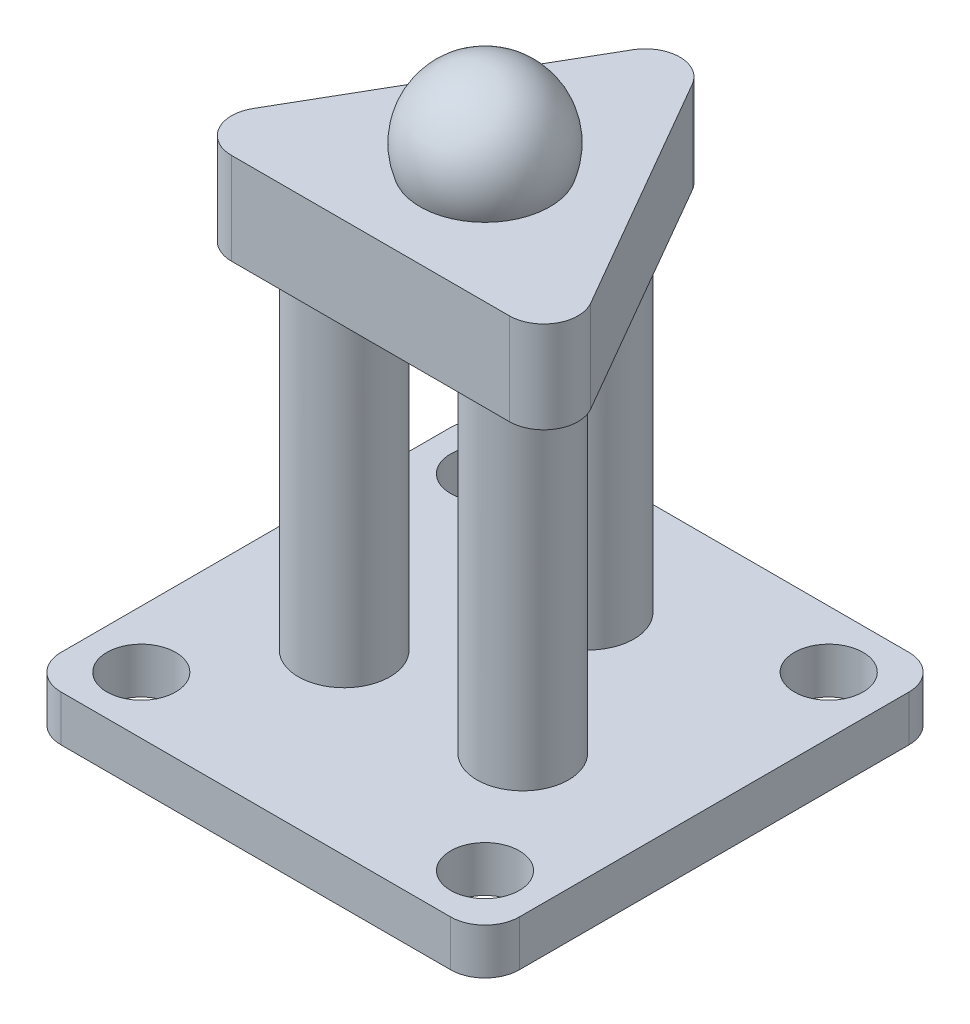
ISO-10303-21;
HEADER;
FILE_DESCRIPTION(('STEP AP214'),'2;1');
FILE_NAME('part.step','',(''),(''),'','','');
FILE_SCHEMA(('AUTOMOTIVE_DESIGN { 1 0 10303 214 1 1 1 1 }'));
ENDSEC;
DATA;
#1=APPLICATION_CONTEXT('core data for automotive mechanical design processes');
#2=APPLICATION_PROTOCOL_DEFINITION('international standard','automotive_design',2000,#1);
#3=PRODUCT_CONTEXT('',#1,'mechanical');
#4=PRODUCT('Part','Part','',(#3));
#5=PRODUCT_RELATED_PRODUCT_CATEGORY('part','',(#4));
#6=PRODUCT_DEFINITION_FORMATION('','',#4);
#7=PRODUCT_DEFINITION_CONTEXT('part definition',#1,'design');
#8=PRODUCT_DEFINITION('design','',#6,#7);
#9=PRODUCT_DEFINITION_SHAPE('','',#8);
#10=(LENGTH_UNIT() NAMED_UNIT(*) SI_UNIT(.MILLI.,.METRE.));
#11=(NAMED_UNIT(*) PLANE_ANGLE_UNIT() SI_UNIT($,.RADIAN.));
#12=(NAMED_UNIT(*) SI_UNIT($,.STERADIAN.) SOLID_ANGLE_UNIT());
#13=UNCERTAINTY_MEASURE_WITH_UNIT(LENGTH_MEASURE(1.E-05),#10,'distance_accuracy_value','');
#14=(GEOMETRIC_REPRESENTATION_CONTEXT(3) GLOBAL_UNCERTAINTY_ASSIGNED_CONTEXT((#13)) GLOBAL_UNIT_ASSIGNED_CONTEXT((#10,
#11,#12)) REPRESENTATION_CONTEXT('',''));
#15=CARTESIAN_POINT('',(0.,0.,0.));
#16=DIRECTION('',(0.,0.,1.));
#17=DIRECTION('',(1.,0.,0.));
#18=AXIS2_PLACEMENT_3D('',#15,#16,#17);
#19=CARTESIAN_POINT('',(8.5,2.,-8.50000000000001));
#20=DIRECTION('',(0.,-1.,0.));
#21=DIRECTION('',(0.,0.,-1.));
#22=AXIS2_PLACEMENT_3D('',#19,#20,#21);
#23=PLANE('',#22);
#24=CARTESIAN_POINT('',(-3.89711431702999,2.,2.24999999999996));
#25=DIRECTION('',(0.,-1.,0.));
#26=DIRECTION('',(0.,0.,-1.));
#27=AXIS2_PLACEMENT_3D('',#24,#25,#26);
#28=CIRCLE('',#27,2.);
#29=CARTESIAN_POINT('',(-3.89711431702999,2.,0.249999999999963));
#30=VERTEX_POINT('',#29);
#31=EDGE_CURVE('E11',#30,#30,#28,.F.);
#32=ORIENTED_EDGE('',*,*,#31,.F.);
#33=EDGE_LOOP('',(#32));
#34=FACE_BOUND('',#33,.T.);
#35=CARTESIAN_POINT('',(3.89711431702996,2.,2.25000000000002));
#36=DIRECTION('',(0.,-1.,0.));
#37=DIRECTION('',(0.,0.,-1.));
#38=AXIS2_PLACEMENT_3D('',#35,#36,#37);
#39=CIRCLE('',#38,2.);
#40=CARTESIAN_POINT('',(3.89711431702996,2.,0.250000000000018));
#41=VERTEX_POINT('',#40);
#42=EDGE_CURVE('E58',#41,#41,#39,.F.);
#43=ORIENTED_EDGE('',*,*,#42,.F.);
#44=EDGE_LOOP('',(#43));
#45=FACE_BOUND('',#44,.T.);
#46=CARTESIAN_POINT('',(0.,2.,-4.5));
#47=DIRECTION('',(0.,-1.,0.));
#48=DIRECTION('',(0.,0.,-1.));
#49=AXIS2_PLACEMENT_3D('',#46,#47,#48);
#50=CIRCLE('',#49,2.);
#51=CARTESIAN_POINT('',(0.,2.,-6.5));
#52=VERTEX_POINT('',#51);
#53=EDGE_CURVE('E200',#52,#52,#50,.F.);
#54=ORIENTED_EDGE('',*,*,#53,.F.);
#55=EDGE_LOOP('',(#54));
#56=FACE_BOUND('',#55,.T.);
#57=CARTESIAN_POINT('',(8.5,2.,-8.50000000000001));
#58=DIRECTION('',(0.,1.,0.));
#59=DIRECTION('',(0.,0.,-1.));
#60=AXIS2_PLACEMENT_3D('',#57,#58,#59);
#61=CIRCLE('',#60,1.5);
#62=CARTESIAN_POINT('',(10.,2.,-8.5));
#63=VERTEX_POINT('',#62);
#64=CARTESIAN_POINT('',(8.49999999999999,2.,-10.));
#65=VERTEX_POINT('',#64);
#66=EDGE_CURVE('E178',#63,#65,#61,.T.);
#67=ORIENTED_EDGE('',*,*,#66,.T.);
#68=DIRECTION('',(-1.,0.,0.));
#69=VECTOR('',#68,1.);
#70=CARTESIAN_POINT('',(-8.49999999999999,2.,-10.));
#71=LINE('',#70,#69);
#72=CARTESIAN_POINT('',(-8.49999999999999,2.,-10.));
#73=VERTEX_POINT('',#72);
#74=EDGE_CURVE('E111',#65,#73,#71,.T.);
#75=ORIENTED_EDGE('',*,*,#74,.T.);
#76=CARTESIAN_POINT('',(-8.50000000000001,2.,-8.50000000000001));
#77=DIRECTION('',(0.,1.,0.));
#78=DIRECTION('',(0.,0.,-1.));
#79=AXIS2_PLACEMENT_3D('',#76,#77,#78);
#80=CIRCLE('',#79,1.5);
#81=CARTESIAN_POINT('',(-10.,2.,-8.5));
#82=VERTEX_POINT('',#81);
#83=EDGE_CURVE('E279',#73,#82,#80,.T.);
#84=ORIENTED_EDGE('',*,*,#83,.T.);
#85=DIRECTION('',(0.,0.,1.));
#86=VECTOR('',#85,1.);
#87=CARTESIAN_POINT('',(-10.,2.,8.49999999999998));
#88=LINE('',#87,#86);
#89=CARTESIAN_POINT('',(-10.,2.,8.49999999999998));
#90=VERTEX_POINT('',#89);
#91=EDGE_CURVE('E286',#82,#90,#88,.T.);
#92=ORIENTED_EDGE('',*,*,#91,.T.);
#93=CARTESIAN_POINT('',(-8.50000000000001,2.,8.49999999999999));
#94=DIRECTION('',(0.,1.,0.));
#95=DIRECTION('',(0.,0.,-1.));
#96=AXIS2_PLACEMENT_3D('',#93,#94,#95);
#97=CIRCLE('',#96,1.5);
#98=CARTESIAN_POINT('',(-8.49999999999999,2.,9.99999999999999));
#99=VERTEX_POINT('',#98);
#100=EDGE_CURVE('E133',#90,#99,#97,.T.);
#101=ORIENTED_EDGE('',*,*,#100,.T.);
#102=DIRECTION('',(1.,0.,0.));
#103=VECTOR('',#102,1.);
#104=CARTESIAN_POINT('',(-8.49999999999999,2.,9.99999999999999));
#105=LINE('',#104,#103);
#106=CARTESIAN_POINT('',(8.49999999999999,2.,9.99999999999999));
#107=VERTEX_POINT('',#106);
#108=EDGE_CURVE('E127',#99,#107,#105,.T.);
#109=ORIENTED_EDGE('',*,*,#108,.T.);
#110=CARTESIAN_POINT('',(8.5,2.,8.49999999999999));
#111=DIRECTION('',(0.,1.,0.));
#112=DIRECTION('',(0.,0.,-1.));
#113=AXIS2_PLACEMENT_3D('',#110,#111,#112);
#114=CIRCLE('',#113,1.5);
#115=CARTESIAN_POINT('',(10.,2.,8.49999999999998));
#116=VERTEX_POINT('',#115);
#117=EDGE_CURVE('E131',#107,#116,#114,.T.);
#118=ORIENTED_EDGE('',*,*,#117,.T.);
#119=DIRECTION('',(0.,0.,-1.));
#120=VECTOR('',#119,1.);
#121=CARTESIAN_POINT('',(10.,2.,8.49999999999998));
#122=LINE('',#121,#120);
#123=EDGE_CURVE('E66',#116,#63,#122,.T.);
#124=ORIENTED_EDGE('',*,*,#123,.T.);
#125=EDGE_LOOP('',(#67,#75,#84,#92,#101,#109,#118,#124));
#126=FACE_BOUND('',#125,.T.);
#127=CARTESIAN_POINT('',(7.5,2.,-7.5));
#128=DIRECTION('',(0.,1.,0.));
#129=DIRECTION('',(0.,0.,1.));
#130=AXIS2_PLACEMENT_3D('',#127,#128,#129);
#131=CIRCLE('',#130,1.5);
#132=CARTESIAN_POINT('',(7.5,2.,-6.));
#133=VERTEX_POINT('',#132);
#134=EDGE_CURVE('E160',#133,#133,#131,.T.);
#135=ORIENTED_EDGE('',*,*,#134,.F.);
#136=EDGE_LOOP('',(#135));
#137=FACE_BOUND('',#136,.T.);
#138=CARTESIAN_POINT('',(-7.5,2.,-7.5));
#139=DIRECTION('',(0.,1.,0.));
#140=DIRECTION('',(0.,0.,1.));
#141=AXIS2_PLACEMENT_3D('',#138,#139,#140);
#142=CIRCLE('',#141,1.5);
#143=CARTESIAN_POINT('',(-7.5,2.,-6.));
#144=VERTEX_POINT('',#143);
#145=EDGE_CURVE('E300',#144,#144,#142,.T.);
#146=ORIENTED_EDGE('',*,*,#145,.F.);
#147=EDGE_LOOP('',(#146));
#148=FACE_BOUND('',#147,.T.);
#149=CARTESIAN_POINT('',(-7.5,2.,7.5));
#150=DIRECTION('',(0.,1.,0.));
#151=DIRECTION('',(0.,0.,1.));
#152=AXIS2_PLACEMENT_3D('',#149,#150,#151);
#153=CIRCLE('',#152,1.5);
#154=CARTESIAN_POINT('',(-7.5,2.,9.));
#155=VERTEX_POINT('',#154);
#156=EDGE_CURVE('E308',#155,#155,#153,.T.);
#157=ORIENTED_EDGE('',*,*,#156,.F.);
#158=EDGE_LOOP('',(#157));
#159=FACE_BOUND('',#158,.T.);
#160=CARTESIAN_POINT('',(7.5,2.,7.5));
#161=DIRECTION('',(0.,1.,0.));
#162=DIRECTION('',(0.,0.,1.));
#163=AXIS2_PLACEMENT_3D('',#160,#161,#162);
#164=CIRCLE('',#163,1.5);
#165=CARTESIAN_POINT('',(7.5,2.,9.));
#166=VERTEX_POINT('',#165);
#167=EDGE_CURVE('E316',#166,#166,#164,.T.);
#168=ORIENTED_EDGE('',*,*,#167,.F.);
#169=EDGE_LOOP('',(#168));
#170=FACE_BOUND('',#169,.T.);
#171=ADVANCED_FACE('F47',(#34,#45,#56,#126,#137,#148,#159,#170),#23,.F.);
#172=CARTESIAN_POINT('',(8.5,0.,-8.50000000000001));
#173=DIRECTION('',(0.,-1.,0.));
#174=DIRECTION('',(0.,0.,-1.));
#175=AXIS2_PLACEMENT_3D('',#172,#173,#174);
#176=PLANE('',#175);
#177=CARTESIAN_POINT('',(-7.5,0.,7.5));
#178=DIRECTION('',(0.,1.,0.));
#179=DIRECTION('',(0.,0.,1.));
#180=AXIS2_PLACEMENT_3D('',#177,#178,#179);
#181=CIRCLE('',#180,1.5);
#182=CARTESIAN_POINT('',(-7.5,0.,9.));
#183=VERTEX_POINT('',#182);
#184=EDGE_CURVE('E312',#183,#183,#181,.T.);
#185=ORIENTED_EDGE('',*,*,#184,.T.);
#186=EDGE_LOOP('',(#185));
#187=FACE_BOUND('',#186,.T.);
#188=CARTESIAN_POINT('',(7.5,0.,-7.5));
#189=DIRECTION('',(0.,1.,0.));
#190=DIRECTION('',(0.,0.,1.));
#191=AXIS2_PLACEMENT_3D('',#188,#189,#190);
#192=CIRCLE('',#191,1.5);
#193=CARTESIAN_POINT('',(7.5,0.,-6.));
#194=VERTEX_POINT('',#193);
#195=EDGE_CURVE('E296',#194,#194,#192,.T.);
#196=ORIENTED_EDGE('',*,*,#195,.T.);
#197=EDGE_LOOP('',(#196));
#198=FACE_BOUND('',#197,.T.);
#199=CARTESIAN_POINT('',(8.5,0.,-8.50000000000001));
#200=DIRECTION('',(0.,1.,0.));
#201=DIRECTION('',(0.,0.,-1.));
#202=AXIS2_PLACEMENT_3D('',#199,#200,#201);
#203=CIRCLE('',#202,1.5);
#204=CARTESIAN_POINT('',(10.,0.,-8.5));
#205=VERTEX_POINT('',#204);
#206=CARTESIAN_POINT('',(8.49999999999999,0.,-10.));
#207=VERTEX_POINT('',#206);
#208=EDGE_CURVE('E155',#205,#207,#203,.T.);
#209=ORIENTED_EDGE('',*,*,#208,.F.);
#210=DIRECTION('',(0.,0.,-1.));
#211=VECTOR('',#210,1.);
#212=CARTESIAN_POINT('',(10.,0.,8.49999999999998));
#213=LINE('',#212,#211);
#214=CARTESIAN_POINT('',(10.,0.,8.49999999999998));
#215=VERTEX_POINT('',#214);
#216=EDGE_CURVE('E102',#215,#205,#213,.T.);
#217=ORIENTED_EDGE('',*,*,#216,.F.);
#218=CARTESIAN_POINT('',(8.5,0.,8.49999999999999));
#219=DIRECTION('',(0.,1.,0.));
#220=DIRECTION('',(0.,0.,-1.));
#221=AXIS2_PLACEMENT_3D('',#218,#219,#220);
#222=CIRCLE('',#221,1.5);
#223=CARTESIAN_POINT('',(8.49999999999999,0.,9.99999999999999));
#224=VERTEX_POINT('',#223);
#225=EDGE_CURVE('E96',#224,#215,#222,.T.);
#226=ORIENTED_EDGE('',*,*,#225,.F.);
#227=DIRECTION('',(1.,0.,0.));
#228=VECTOR('',#227,1.);
#229=CARTESIAN_POINT('',(-8.49999999999999,0.,9.99999999999999));
#230=LINE('',#229,#228);
#231=CARTESIAN_POINT('',(-8.49999999999999,0.,9.99999999999999));
#232=VERTEX_POINT('',#231);
#233=EDGE_CURVE('E142',#232,#224,#230,.T.);
#234=ORIENTED_EDGE('',*,*,#233,.F.);
#235=CARTESIAN_POINT('',(-8.50000000000001,0.,8.49999999999999));
#236=DIRECTION('',(0.,1.,0.));
#237=DIRECTION('',(0.,0.,-1.));
#238=AXIS2_PLACEMENT_3D('',#235,#236,#237);
#239=CIRCLE('',#238,1.5);
#240=CARTESIAN_POINT('',(-10.,0.,8.49999999999998));
#241=VERTEX_POINT('',#240);
#242=EDGE_CURVE('E169',#241,#232,#239,.T.);
#243=ORIENTED_EDGE('',*,*,#242,.F.);
#244=DIRECTION('',(0.,0.,1.));
#245=VECTOR('',#244,1.);
#246=CARTESIAN_POINT('',(-10.,0.,8.49999999999998));
#247=LINE('',#246,#245);
#248=CARTESIAN_POINT('',(-10.,0.,-8.5));
#249=VERTEX_POINT('',#248);
#250=EDGE_CURVE('E166',#249,#241,#247,.T.);
#251=ORIENTED_EDGE('',*,*,#250,.F.);
#252=CARTESIAN_POINT('',(-8.50000000000001,0.,-8.50000000000001));
#253=DIRECTION('',(0.,1.,0.));
#254=DIRECTION('',(0.,0.,-1.));
#255=AXIS2_PLACEMENT_3D('',#252,#253,#254);
#256=CIRCLE('',#255,1.5);
#257=CARTESIAN_POINT('',(-8.49999999999999,0.,-10.));
#258=VERTEX_POINT('',#257);
#259=EDGE_CURVE('E163',#258,#249,#256,.T.);
#260=ORIENTED_EDGE('',*,*,#259,.F.);
#261=DIRECTION('',(-1.,0.,0.));
#262=VECTOR('',#261,1.);
#263=CARTESIAN_POINT('',(-8.49999999999999,0.,-10.));
#264=LINE('',#263,#262);
#265=EDGE_CURVE('E159',#207,#258,#264,.T.);
#266=ORIENTED_EDGE('',*,*,#265,.F.);
#267=EDGE_LOOP('',(#209,#217,#226,#234,#243,#251,#260,#266));
#268=FACE_BOUND('',#267,.T.);
#269=CARTESIAN_POINT('',(-7.5,0.,-7.5));
#270=DIRECTION('',(0.,1.,0.));
#271=DIRECTION('',(0.,0.,1.));
#272=AXIS2_PLACEMENT_3D('',#269,#270,#271);
#273=CIRCLE('',#272,1.5);
#274=CARTESIAN_POINT('',(-7.5,0.,-6.));
#275=VERTEX_POINT('',#274);
#276=EDGE_CURVE('E304',#275,#275,#273,.T.);
#277=ORIENTED_EDGE('',*,*,#276,.T.);
#278=EDGE_LOOP('',(#277));
#279=FACE_BOUND('',#278,.T.);
#280=CARTESIAN_POINT('',(7.5,0.,7.5));
#281=DIRECTION('',(0.,1.,0.));
#282=DIRECTION('',(0.,0.,1.));
#283=AXIS2_PLACEMENT_3D('',#280,#281,#282);
#284=CIRCLE('',#283,1.5);
#285=CARTESIAN_POINT('',(7.5,0.,9.));
#286=VERTEX_POINT('',#285);
#287=EDGE_CURVE('E320',#286,#286,#284,.T.);
#288=ORIENTED_EDGE('',*,*,#287,.T.);
#289=EDGE_LOOP('',(#288));
#290=FACE_BOUND('',#289,.T.);
#291=ADVANCED_FACE('F212',(#187,#198,#268,#279,#290),#176,.T.);
#292=CARTESIAN_POINT('',(8.5,2.,-8.50000000000001));
#293=DIRECTION('',(0.,-1.,0.));
#294=DIRECTION('',(0.,0.,-1.));
#295=AXIS2_PLACEMENT_3D('',#292,#293,#294);
#296=CYLINDRICAL_SURFACE('',#295,1.5);
#297=ORIENTED_EDGE('',*,*,#208,.T.);
#298=DIRECTION('',(0.,-1.,0.));
#299=VECTOR('',#298,1.);
#300=CARTESIAN_POINT('',(8.49999999999999,2.,-10.));
#301=LINE('',#300,#299);
#302=EDGE_CURVE('E197',#65,#207,#301,.T.);
#303=ORIENTED_EDGE('',*,*,#302,.F.);
#304=ORIENTED_EDGE('',*,*,#66,.F.);
#305=DIRECTION('',(0.,-1.,0.));
#306=VECTOR('',#305,1.);
#307=CARTESIAN_POINT('',(10.,2.,-8.5));
#308=LINE('',#307,#306);
#309=EDGE_CURVE('E151',#63,#205,#308,.T.);
#310=ORIENTED_EDGE('',*,*,#309,.T.);
#311=EDGE_LOOP('',(#297,#303,#304,#310));
#312=FACE_BOUND('',#311,.T.);
#313=ADVANCED_FACE('F49',(#312),#296,.T.);
#314=CARTESIAN_POINT('',(-8.49999999999999,2.,-10.));
#315=DIRECTION('',(0.,0.,1.));
#316=DIRECTION('',(1.,0.,0.));
#317=AXIS2_PLACEMENT_3D('',#314,#315,#316);
#318=PLANE('',#317);
#319=ORIENTED_EDGE('',*,*,#265,.T.);
#320=DIRECTION('',(0.,-1.,0.));
#321=VECTOR('',#320,1.);
#322=CARTESIAN_POINT('',(-8.49999999999999,2.,-10.));
#323=LINE('',#322,#321);
#324=EDGE_CURVE('E193',#73,#258,#323,.T.);
#325=ORIENTED_EDGE('',*,*,#324,.F.);
#326=ORIENTED_EDGE('',*,*,#74,.F.);
#327=ORIENTED_EDGE('',*,*,#302,.T.);
#328=EDGE_LOOP('',(#319,#325,#326,#327));
#329=FACE_BOUND('',#328,.T.);
#330=ADVANCED_FACE('F266',(#329),#318,.F.);
#331=CARTESIAN_POINT('',(-8.50000000000001,2.,-8.50000000000001));
#332=DIRECTION('',(0.,-1.,0.));
#333=DIRECTION('',(0.,0.,-1.));
#334=AXIS2_PLACEMENT_3D('',#331,#332,#333);
#335=CYLINDRICAL_SURFACE('',#334,1.5);
#336=ORIENTED_EDGE('',*,*,#259,.T.);
#337=DIRECTION('',(0.,-1.,0.));
#338=VECTOR('',#337,1.);
#339=CARTESIAN_POINT('',(-10.,2.,-8.5));
#340=LINE('',#339,#338);
#341=EDGE_CURVE('E189',#82,#249,#340,.T.);
#342=ORIENTED_EDGE('',*,*,#341,.F.);
#343=ORIENTED_EDGE('',*,*,#83,.F.);
#344=ORIENTED_EDGE('',*,*,#324,.T.);
#345=EDGE_LOOP('',(#336,#342,#343,#344));
#346=FACE_BOUND('',#345,.T.);
#347=ADVANCED_FACE('F263',(#346),#335,.T.);
#348=CARTESIAN_POINT('',(-10.,2.,8.49999999999998));
#349=DIRECTION('',(1.,0.,0.));
#350=DIRECTION('',(0.,0.,-1.));
#351=AXIS2_PLACEMENT_3D('',#348,#349,#350);
#352=PLANE('',#351);
#353=ORIENTED_EDGE('',*,*,#250,.T.);
#354=DIRECTION('',(0.,-1.,0.));
#355=VECTOR('',#354,1.);
#356=CARTESIAN_POINT('',(-10.,2.,8.49999999999998));
#357=LINE('',#356,#355);
#358=EDGE_CURVE('E185',#90,#241,#357,.T.);
#359=ORIENTED_EDGE('',*,*,#358,.F.);
#360=ORIENTED_EDGE('',*,*,#91,.F.);
#361=ORIENTED_EDGE('',*,*,#341,.T.);
#362=EDGE_LOOP('',(#353,#359,#360,#361));
#363=FACE_BOUND('',#362,.T.);
#364=ADVANCED_FACE('F259',(#363),#352,.F.);
#365=CARTESIAN_POINT('',(-8.50000000000001,2.,8.49999999999999));
#366=DIRECTION('',(0.,-1.,0.));
#367=DIRECTION('',(0.,0.,-1.));
#368=AXIS2_PLACEMENT_3D('',#365,#366,#367);
#369=CYLINDRICAL_SURFACE('',#368,1.5);
#370=ORIENTED_EDGE('',*,*,#242,.T.);
#371=DIRECTION('',(0.,-1.,0.));
#372=VECTOR('',#371,1.);
#373=CARTESIAN_POINT('',(-8.49999999999999,2.,9.99999999999999));
#374=LINE('',#373,#372);
#375=EDGE_CURVE('E144',#99,#232,#374,.T.);
#376=ORIENTED_EDGE('',*,*,#375,.F.);
#377=ORIENTED_EDGE('',*,*,#100,.F.);
#378=ORIENTED_EDGE('',*,*,#358,.T.);
#379=EDGE_LOOP('',(#370,#376,#377,#378));
#380=FACE_BOUND('',#379,.T.);
#381=ADVANCED_FACE('F256',(#380),#369,.T.);
#382=CARTESIAN_POINT('',(-8.49999999999999,2.,9.99999999999999));
#383=DIRECTION('',(0.,0.,-1.));
#384=DIRECTION('',(-1.,0.,0.));
#385=AXIS2_PLACEMENT_3D('',#382,#383,#384);
#386=PLANE('',#385);
#387=ORIENTED_EDGE('',*,*,#233,.T.);
#388=DIRECTION('',(0.,-1.,0.));
#389=VECTOR('',#388,1.);
#390=CARTESIAN_POINT('',(8.49999999999999,2.,9.99999999999999));
#391=LINE('',#390,#389);
#392=EDGE_CURVE('E139',#107,#224,#391,.T.);
#393=ORIENTED_EDGE('',*,*,#392,.F.);
#394=ORIENTED_EDGE('',*,*,#108,.F.);
#395=ORIENTED_EDGE('',*,*,#375,.T.);
#396=EDGE_LOOP('',(#387,#393,#394,#395));
#397=FACE_BOUND('',#396,.T.);
#398=ADVANCED_FACE('F140',(#397),#386,.F.);
#399=CARTESIAN_POINT('',(8.5,2.,8.49999999999999));
#400=DIRECTION('',(0.,-1.,0.));
#401=DIRECTION('',(0.,0.,-1.));
#402=AXIS2_PLACEMENT_3D('',#399,#400,#401);
#403=CYLINDRICAL_SURFACE('',#402,1.5);
#404=ORIENTED_EDGE('',*,*,#225,.T.);
#405=DIRECTION('',(0.,-1.,0.));
#406=VECTOR('',#405,1.);
#407=CARTESIAN_POINT('',(10.,2.,8.49999999999998));
#408=LINE('',#407,#406);
#409=EDGE_CURVE('E145',#116,#215,#408,.T.);
#410=ORIENTED_EDGE('',*,*,#409,.F.);
#411=ORIENTED_EDGE('',*,*,#117,.F.);
#412=ORIENTED_EDGE('',*,*,#392,.T.);
#413=EDGE_LOOP('',(#404,#410,#411,#412));
#414=FACE_BOUND('',#413,.T.);
#415=ADVANCED_FACE('F147',(#414),#403,.T.);
#416=CARTESIAN_POINT('',(10.,2.,8.49999999999998));
#417=DIRECTION('',(-1.,0.,0.));
#418=DIRECTION('',(0.,0.,1.));
#419=AXIS2_PLACEMENT_3D('',#416,#417,#418);
#420=PLANE('',#419);
#421=ORIENTED_EDGE('',*,*,#216,.T.);
#422=ORIENTED_EDGE('',*,*,#309,.F.);
#423=ORIENTED_EDGE('',*,*,#123,.F.);
#424=ORIENTED_EDGE('',*,*,#409,.T.);
#425=EDGE_LOOP('',(#421,#422,#423,#424));
#426=FACE_BOUND('',#425,.T.);
#427=ADVANCED_FACE('F244',(#426),#420,.F.);
#428=CARTESIAN_POINT('',(7.5,2.,-7.5));
#429=DIRECTION('',(0.,-1.,0.));
#430=DIRECTION('',(0.,0.,-1.));
#431=AXIS2_PLACEMENT_3D('',#428,#429,#430);
#432=CYLINDRICAL_SURFACE('',#431,1.5);
#433=ORIENTED_EDGE('',*,*,#134,.T.);
#434=EDGE_LOOP('',(#433));
#435=FACE_BOUND('',#434,.T.);
#436=ORIENTED_EDGE('',*,*,#195,.F.);
#437=EDGE_LOOP('',(#436));
#438=FACE_BOUND('',#437,.T.);
#439=ADVANCED_FACE('F241',(#435,#438),#432,.F.);
#440=CARTESIAN_POINT('',(-7.5,2.,-7.5));
#441=DIRECTION('',(0.,-1.,0.));
#442=DIRECTION('',(0.,0.,-1.));
#443=AXIS2_PLACEMENT_3D('',#440,#441,#442);
#444=CYLINDRICAL_SURFACE('',#443,1.5);
#445=ORIENTED_EDGE('',*,*,#145,.T.);
#446=EDGE_LOOP('',(#445));
#447=FACE_BOUND('',#446,.T.);
#448=ORIENTED_EDGE('',*,*,#276,.F.);
#449=EDGE_LOOP('',(#448));
#450=FACE_BOUND('',#449,.T.);
#451=ADVANCED_FACE('F237',(#447,#450),#444,.F.);
#452=CARTESIAN_POINT('',(-7.5,2.,7.5));
#453=DIRECTION('',(0.,-1.,0.));
#454=DIRECTION('',(0.,0.,-1.));
#455=AXIS2_PLACEMENT_3D('',#452,#453,#454);
#456=CYLINDRICAL_SURFACE('',#455,1.5);
#457=ORIENTED_EDGE('',*,*,#156,.T.);
#458=EDGE_LOOP('',(#457));
#459=FACE_BOUND('',#458,.T.);
#460=ORIENTED_EDGE('',*,*,#184,.F.);
#461=EDGE_LOOP('',(#460));
#462=FACE_BOUND('',#461,.T.);
#463=ADVANCED_FACE('F229',(#459,#462),#456,.F.);
#464=CARTESIAN_POINT('',(7.5,2.,7.5));
#465=DIRECTION('',(0.,-1.,0.));
#466=DIRECTION('',(0.,0.,-1.));
#467=AXIS2_PLACEMENT_3D('',#464,#465,#466);
#468=CYLINDRICAL_SURFACE('',#467,1.5);
#469=ORIENTED_EDGE('',*,*,#167,.T.);
#470=EDGE_LOOP('',(#469));
#471=FACE_BOUND('',#470,.T.);
#472=ORIENTED_EDGE('',*,*,#287,.F.);
#473=EDGE_LOOP('',(#472));
#474=FACE_BOUND('',#473,.T.);
#475=ADVANCED_FACE('F219',(#471,#474),#468,.F.);
#476=CARTESIAN_POINT('',(0.,17.,-4.5));
#477=DIRECTION('',(0.,-1.,0.));
#478=DIRECTION('',(0.,0.,-1.));
#479=AXIS2_PLACEMENT_3D('',#476,#477,#478);
#480=CYLINDRICAL_SURFACE('',#479,2.);
#481=CARTESIAN_POINT('',(0.,17.,-4.5));
#482=DIRECTION('',(0.,1.,0.));
#483=DIRECTION('',(0.,0.,1.));
#484=AXIS2_PLACEMENT_3D('',#481,#482,#483);
#485=CIRCLE('',#484,2.);
#486=CARTESIAN_POINT('',(0.,17.,-2.5));
#487=VERTEX_POINT('',#486);
#488=EDGE_CURVE('E324',#487,#487,#485,.T.);
#489=ORIENTED_EDGE('',*,*,#488,.F.);
#490=EDGE_LOOP('',(#489));
#491=FACE_BOUND('',#490,.T.);
#492=ORIENTED_EDGE('',*,*,#53,.T.);
#493=EDGE_LOOP('',(#492));
#494=FACE_BOUND('',#493,.T.);
#495=ADVANCED_FACE('F217',(#491,#494),#480,.T.);
#496=CARTESIAN_POINT('',(3.89711431702996,17.,2.25000000000002));
#497=DIRECTION('',(0.,-1.,0.));
#498=DIRECTION('',(0.,0.,-1.));
#499=AXIS2_PLACEMENT_3D('',#496,#497,#498);
#500=CYLINDRICAL_SURFACE('',#499,2.);
#501=CARTESIAN_POINT('',(3.89711431702996,17.,2.25000000000002));
#502=DIRECTION('',(0.,1.,0.));
#503=DIRECTION('',(0.,0.,1.));
#504=AXIS2_PLACEMENT_3D('',#501,#502,#503);
#505=CIRCLE('',#504,2.);
#506=CARTESIAN_POINT('',(3.89711431702996,17.,4.25000000000002));
#507=VERTEX_POINT('',#506);
#508=EDGE_CURVE('E331',#507,#507,#505,.T.);
#509=ORIENTED_EDGE('',*,*,#508,.F.);
#510=EDGE_LOOP('',(#509));
#511=FACE_BOUND('',#510,.T.);
#512=ORIENTED_EDGE('',*,*,#42,.T.);
#513=EDGE_LOOP('',(#512));
#514=FACE_BOUND('',#513,.T.);
#515=ADVANCED_FACE('F208',(#511,#514),#500,.T.);
#516=CARTESIAN_POINT('',(-3.89711431702999,17.,2.24999999999996));
#517=DIRECTION('',(0.,-1.,0.));
#518=DIRECTION('',(0.,0.,-1.));
#519=AXIS2_PLACEMENT_3D('',#516,#517,#518);
#520=CYLINDRICAL_SURFACE('',#519,2.);
#521=CARTESIAN_POINT('',(-3.89711431702999,17.,2.24999999999996));
#522=DIRECTION('',(0.,1.,0.));
#523=DIRECTION('',(0.,0.,1.));
#524=AXIS2_PLACEMENT_3D('',#521,#522,#523);
#525=CIRCLE('',#524,2.);
#526=CARTESIAN_POINT('',(-3.89711431702999,17.,4.24999999999996));
#527=VERTEX_POINT('',#526);
#528=EDGE_CURVE('E335',#527,#527,#525,.T.);
#529=ORIENTED_EDGE('',*,*,#528,.F.);
#530=EDGE_LOOP('',(#529));
#531=FACE_BOUND('',#530,.T.);
#532=ORIENTED_EDGE('',*,*,#31,.T.);
#533=EDGE_LOOP('',(#532));
#534=FACE_BOUND('',#533,.T.);
#535=ADVANCED_FACE('F225',(#531,#534),#520,.T.);
#536=CARTESIAN_POINT('',(6.06217782649112,21.,3.49999999999994));
#537=DIRECTION('',(0.,-1.,0.));
#538=DIRECTION('',(0.,0.,-1.));
#539=AXIS2_PLACEMENT_3D('',#536,#537,#538);
#540=CYLINDRICAL_SURFACE('',#539,1.5);
#541=CARTESIAN_POINT('',(6.06217782649112,17.,3.49999999999994));
#542=DIRECTION('',(0.,1.,0.));
#543=DIRECTION('',(0.,0.,-1.));
#544=AXIS2_PLACEMENT_3D('',#541,#542,#543);
#545=CIRCLE('',#544,1.5);
#546=CARTESIAN_POINT('',(6.06217782649111,17.,4.99999999999994));
#547=VERTEX_POINT('',#546);
#548=CARTESIAN_POINT('',(7.36121593216785,17.,2.75000000000007));
#549=VERTEX_POINT('',#548);
#550=EDGE_CURVE('E385',#547,#549,#545,.T.);
#551=ORIENTED_EDGE('',*,*,#550,.T.);
#552=DIRECTION('',(0.,-1.,0.));
#553=VECTOR('',#552,1.);
#554=CARTESIAN_POINT('',(7.36121593216785,21.,2.75000000000007));
#555=LINE('',#554,#553);
#556=CARTESIAN_POINT('',(7.36121593216785,21.,2.75000000000007));
#557=VERTEX_POINT('',#556);
#558=EDGE_CURVE('E339',#557,#549,#555,.T.);
#559=ORIENTED_EDGE('',*,*,#558,.F.);
#560=CARTESIAN_POINT('',(6.06217782649112,21.,3.49999999999994));
#561=DIRECTION('',(0.,1.,0.));
#562=DIRECTION('',(0.,0.,-1.));
#563=AXIS2_PLACEMENT_3D('',#560,#561,#562);
#564=CIRCLE('',#563,1.5);
#565=CARTESIAN_POINT('',(6.06217782649111,21.,4.99999999999994));
#566=VERTEX_POINT('',#565);
#567=EDGE_CURVE('E368',#566,#557,#564,.T.);
#568=ORIENTED_EDGE('',*,*,#567,.F.);
#569=DIRECTION('',(0.,-1.,0.));
#570=VECTOR('',#569,1.);
#571=CARTESIAN_POINT('',(6.06217782649111,21.,4.99999999999994));
#572=LINE('',#571,#570);
#573=EDGE_CURVE('E359',#566,#547,#572,.T.);
#574=ORIENTED_EDGE('',*,*,#573,.T.);
#575=EDGE_LOOP('',(#551,#559,#568,#574));
#576=FACE_BOUND('',#575,.T.);
#577=ADVANCED_FACE('F422',(#576),#540,.T.);
#578=CARTESIAN_POINT('',(7.36121593216785,21.,2.75000000000007));
#579=DIRECTION('',(-0.866025403784436,0.,0.500000000000004));
#580=DIRECTION('',(0.500000000000004,0.,0.866025403784436));
#581=AXIS2_PLACEMENT_3D('',#578,#579,#580);
#582=PLANE('',#581);
#583=DIRECTION('',(-0.500000000000004,0.,-0.866025403784436));
#584=VECTOR('',#583,1.);
#585=CARTESIAN_POINT('',(7.36121593216785,17.,2.75000000000007));
#586=LINE('',#585,#584);
#587=CARTESIAN_POINT('',(1.29903810567667,17.,-7.75));
#588=VERTEX_POINT('',#587);
#589=EDGE_CURVE('E381',#549,#588,#586,.T.);
#590=ORIENTED_EDGE('',*,*,#589,.T.);
#591=DIRECTION('',(0.,-1.,0.));
#592=VECTOR('',#591,1.);
#593=CARTESIAN_POINT('',(1.29903810567667,21.,-7.75));
#594=LINE('',#593,#592);
#595=CARTESIAN_POINT('',(1.29903810567667,21.,-7.75));
#596=VERTEX_POINT('',#595);
#597=EDGE_CURVE('E343',#596,#588,#594,.T.);
#598=ORIENTED_EDGE('',*,*,#597,.F.);
#599=DIRECTION('',(-0.500000000000004,0.,-0.866025403784436));
#600=VECTOR('',#599,1.);
#601=CARTESIAN_POINT('',(7.36121593216785,21.,2.75000000000007));
#602=LINE('',#601,#600);
#603=EDGE_CURVE('E404',#557,#596,#602,.T.);
#604=ORIENTED_EDGE('',*,*,#603,.F.);
#605=ORIENTED_EDGE('',*,*,#558,.T.);
#606=EDGE_LOOP('',(#590,#598,#604,#605));
#607=FACE_BOUND('',#606,.T.);
#608=ADVANCED_FACE('F426',(#607),#582,.F.);
#609=CARTESIAN_POINT('',(0.,21.,-7.00000000000001));
#610=DIRECTION('',(0.,-1.,0.));
#611=DIRECTION('',(0.,0.,-1.));
#612=AXIS2_PLACEMENT_3D('',#609,#610,#611);
#613=CYLINDRICAL_SURFACE('',#612,1.5);
#614=CARTESIAN_POINT('',(0.,17.,-7.00000000000001));
#615=DIRECTION('',(0.,1.,0.));
#616=DIRECTION('',(0.,0.,1.));
#617=AXIS2_PLACEMENT_3D('',#614,#615,#616);
#618=CIRCLE('',#617,1.5);
#619=CARTESIAN_POINT('',(-1.29903810567666,17.,-7.74999999999999));
#620=VERTEX_POINT('',#619);
#621=EDGE_CURVE('E377',#588,#620,#618,.T.);
#622=ORIENTED_EDGE('',*,*,#621,.T.);
#623=DIRECTION('',(0.,-1.,0.));
#624=VECTOR('',#623,1.);
#625=CARTESIAN_POINT('',(-1.29903810567666,21.,-7.74999999999999));
#626=LINE('',#625,#624);
#627=CARTESIAN_POINT('',(-1.29903810567666,21.,-7.74999999999999));
#628=VERTEX_POINT('',#627);
#629=EDGE_CURVE('E347',#628,#620,#626,.T.);
#630=ORIENTED_EDGE('',*,*,#629,.F.);
#631=CARTESIAN_POINT('',(0.,21.,-7.00000000000001));
#632=DIRECTION('',(0.,1.,0.));
#633=DIRECTION('',(0.,0.,1.));
#634=AXIS2_PLACEMENT_3D('',#631,#632,#633);
#635=CIRCLE('',#634,1.5);
#636=EDGE_CURVE('E400',#596,#628,#635,.T.);
#637=ORIENTED_EDGE('',*,*,#636,.F.);
#638=ORIENTED_EDGE('',*,*,#597,.T.);
#639=EDGE_LOOP('',(#622,#630,#637,#638));
#640=FACE_BOUND('',#639,.T.);
#641=ADVANCED_FACE('F469',(#640),#613,.T.);
#642=CARTESIAN_POINT('',(-1.29903810567666,21.,-7.74999999999999));
#643=DIRECTION('',(0.866025403784436,0.,0.500000000000005));
#644=DIRECTION('',(0.500000000000005,0.,-0.866025403784436));
#645=AXIS2_PLACEMENT_3D('',#642,#643,#644);
#646=PLANE('',#645);
#647=DIRECTION('',(-0.500000000000005,0.,0.866025403784436));
#648=VECTOR('',#647,1.);
#649=CARTESIAN_POINT('',(-1.29903810567666,17.,-7.74999999999999));
#650=LINE('',#649,#648);
#651=CARTESIAN_POINT('',(-7.36121593216785,17.,2.75000000000007));
#652=VERTEX_POINT('',#651);
#653=EDGE_CURVE('E373',#620,#652,#650,.T.);
#654=ORIENTED_EDGE('',*,*,#653,.T.);
#655=DIRECTION('',(0.,-1.,0.));
#656=VECTOR('',#655,1.);
#657=CARTESIAN_POINT('',(-7.36121593216785,21.,2.75000000000007));
#658=LINE('',#657,#656);
#659=CARTESIAN_POINT('',(-7.36121593216785,21.,2.75000000000007));
#660=VERTEX_POINT('',#659);
#661=EDGE_CURVE('E351',#660,#652,#658,.T.);
#662=ORIENTED_EDGE('',*,*,#661,.F.);
#663=DIRECTION('',(-0.500000000000005,0.,0.866025403784436));
#664=VECTOR('',#663,1.);
#665=CARTESIAN_POINT('',(-1.29903810567666,21.,-7.74999999999999));
#666=LINE('',#665,#664);
#667=EDGE_CURVE('E396',#628,#660,#666,.T.);
#668=ORIENTED_EDGE('',*,*,#667,.F.);
#669=ORIENTED_EDGE('',*,*,#629,.T.);
#670=EDGE_LOOP('',(#654,#662,#668,#669));
#671=FACE_BOUND('',#670,.T.);
#672=ADVANCED_FACE('F466',(#671),#646,.F.);
#673=CARTESIAN_POINT('',(-6.06217782649105,21.,3.50000000000003));
#674=DIRECTION('',(0.,-1.,0.));
#675=DIRECTION('',(0.,0.,-1.));
#676=AXIS2_PLACEMENT_3D('',#673,#674,#675);
#677=CYLINDRICAL_SURFACE('',#676,1.50000000000008);
#678=CARTESIAN_POINT('',(-6.06217782649105,17.,3.50000000000003));
#679=DIRECTION('',(0.,1.,0.));
#680=DIRECTION('',(0.,0.,-1.));
#681=AXIS2_PLACEMENT_3D('',#678,#679,#680);
#682=CIRCLE('',#681,1.50000000000008);
#683=CARTESIAN_POINT('',(-6.0621778264912,17.,5.0000000000001));
#684=VERTEX_POINT('',#683);
#685=EDGE_CURVE('E369',#652,#684,#682,.T.);
#686=ORIENTED_EDGE('',*,*,#685,.T.);
#687=DIRECTION('',(0.,-1.,0.));
#688=VECTOR('',#687,1.);
#689=CARTESIAN_POINT('',(-6.0621778264912,21.,5.0000000000001));
#690=LINE('',#689,#688);
#691=CARTESIAN_POINT('',(-6.0621778264912,21.,5.0000000000001));
#692=VERTEX_POINT('',#691);
#693=EDGE_CURVE('E355',#692,#684,#690,.T.);
#694=ORIENTED_EDGE('',*,*,#693,.F.);
#695=CARTESIAN_POINT('',(-6.06217782649105,21.,3.50000000000003));
#696=DIRECTION('',(0.,1.,0.));
#697=DIRECTION('',(0.,0.,-1.));
#698=AXIS2_PLACEMENT_3D('',#695,#696,#697);
#699=CIRCLE('',#698,1.50000000000008);
#700=EDGE_CURVE('E392',#660,#692,#699,.T.);
#701=ORIENTED_EDGE('',*,*,#700,.F.);
#702=ORIENTED_EDGE('',*,*,#661,.T.);
#703=EDGE_LOOP('',(#686,#694,#701,#702));
#704=FACE_BOUND('',#703,.T.);
#705=ADVANCED_FACE('F463',(#704),#677,.T.);
#706=CARTESIAN_POINT('',(-6.0621778264912,21.,5.00000000000007));
#707=DIRECTION('',(0.,0.,-1.));
#708=DIRECTION('',(-1.,0.,0.));
#709=AXIS2_PLACEMENT_3D('',#706,#707,#708);
#710=PLANE('',#709);
#711=DIRECTION('',(1.,0.,0.));
#712=VECTOR('',#711,1.);
#713=CARTESIAN_POINT('',(-6.0621778264912,17.,5.00000000000007));
#714=LINE('',#713,#712);
#715=EDGE_CURVE('E364',#684,#547,#714,.T.);
#716=ORIENTED_EDGE('',*,*,#715,.T.);
#717=ORIENTED_EDGE('',*,*,#573,.F.);
#718=DIRECTION('',(1.,0.,0.));
#719=VECTOR('',#718,1.);
#720=CARTESIAN_POINT('',(-6.0621778264912,21.,5.00000000000007));
#721=LINE('',#720,#719);
#722=EDGE_CURVE('E363',#692,#566,#721,.T.);
#723=ORIENTED_EDGE('',*,*,#722,.F.);
#724=ORIENTED_EDGE('',*,*,#693,.T.);
#725=EDGE_LOOP('',(#716,#717,#723,#724));
#726=FACE_BOUND('',#725,.T.);
#727=ADVANCED_FACE('F445',(#726),#710,.F.);
#728=CARTESIAN_POINT('',(6.06217782649112,21.,3.49999999999994));
#729=DIRECTION('',(0.,-1.,0.));
#730=DIRECTION('',(0.,0.,-1.));
#731=AXIS2_PLACEMENT_3D('',#728,#729,#730);
#732=PLANE('',#731);
#733=CARTESIAN_POINT('',(0.,21.,0.));
#734=DIRECTION('',(0.,-1.,0.));
#735=DIRECTION('',(0.,0.,-1.));
#736=AXIS2_PLACEMENT_3D('',#733,#734,#735);
#737=CIRCLE('',#736,2.82842712474619);
#738=CARTESIAN_POINT('',(0.,21.,-2.82842712474619));
#739=VERTEX_POINT('',#738);
#740=EDGE_CURVE('E51',#739,#739,#737,.T.);
#741=ORIENTED_EDGE('',*,*,#740,.T.);
#742=EDGE_LOOP('',(#741));
#743=FACE_BOUND('',#742,.T.);
#744=ORIENTED_EDGE('',*,*,#567,.T.);
#745=ORIENTED_EDGE('',*,*,#603,.T.);
#746=ORIENTED_EDGE('',*,*,#636,.T.);
#747=ORIENTED_EDGE('',*,*,#667,.T.);
#748=ORIENTED_EDGE('',*,*,#700,.T.);
#749=ORIENTED_EDGE('',*,*,#722,.T.);
#750=EDGE_LOOP('',(#744,#745,#746,#747,#748,#749));
#751=FACE_BOUND('',#750,.T.);
#752=ADVANCED_FACE('F414',(#743,#751),#732,.F.);
#753=CARTESIAN_POINT('',(6.06217782649112,17.,3.49999999999994));
#754=DIRECTION('',(0.,-1.,0.));
#755=DIRECTION('',(0.,0.,-1.));
#756=AXIS2_PLACEMENT_3D('',#753,#754,#755);
#757=PLANE('',#756);
#758=ORIENTED_EDGE('',*,*,#488,.T.);
#759=EDGE_LOOP('',(#758));
#760=FACE_BOUND('',#759,.T.);
#761=ORIENTED_EDGE('',*,*,#508,.T.);
#762=EDGE_LOOP('',(#761));
#763=FACE_BOUND('',#762,.T.);
#764=ORIENTED_EDGE('',*,*,#528,.T.);
#765=EDGE_LOOP('',(#764));
#766=FACE_BOUND('',#765,.T.);
#767=ORIENTED_EDGE('',*,*,#550,.F.);
#768=ORIENTED_EDGE('',*,*,#715,.F.);
#769=ORIENTED_EDGE('',*,*,#685,.F.);
#770=ORIENTED_EDGE('',*,*,#653,.F.);
#771=ORIENTED_EDGE('',*,*,#621,.F.);
#772=ORIENTED_EDGE('',*,*,#589,.F.);
#773=EDGE_LOOP('',(#767,#768,#769,#770,#771,#772));
#774=FACE_BOUND('',#773,.T.);
#775=ADVANCED_FACE('F446',(#760,#763,#766,#774),#757,.T.);
#776=CARTESIAN_POINT('',(0.,22.,0.));
#777=DIRECTION('',(0.,-1.,0.));
#778=DIRECTION('',(-1.,0.,0.));
#779=AXIS2_PLACEMENT_3D('',#776,#777,#778);
#780=SPHERICAL_SURFACE('',#779,3.);
#781=ORIENTED_EDGE('',*,*,#740,.F.);
#782=EDGE_LOOP('',(#781));
#783=FACE_BOUND('',#782,.T.);
#784=ADVANCED_FACE('F448',(#783),#780,.T.);
#785=CLOSED_SHELL('',(#171,#291,#313,#330,#347,#364,#381,#398,#415,#427,#439,#451,#463,#475,
#495,#515,#535,#577,#608,#641,#672,#705,#727,#752,#775,#784));
#786=MANIFOLD_SOLID_BREP('B2',#785);
#787=ADVANCED_BREP_SHAPE_REPRESENTATION('',(#18,#786),#14);
#788=SHAPE_DEFINITION_REPRESENTATION(#9,#787);
ENDSEC;
END-ISO-10303-21;
